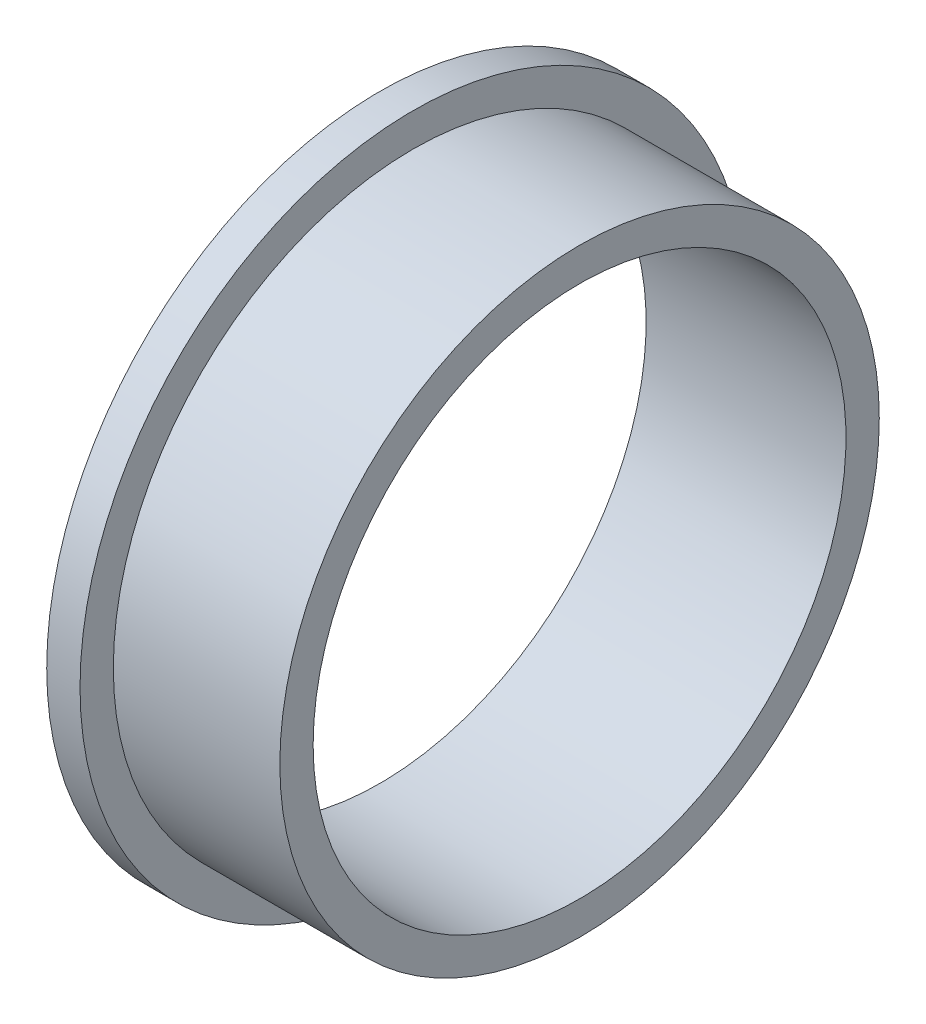
ISO-10303-21;
HEADER;
FILE_DESCRIPTION(('STEP AP214'),'2;1');
FILE_NAME('part.step','',(''),(''),'','','');
FILE_SCHEMA(('AUTOMOTIVE_DESIGN { 1 0 10303 214 1 1 1 1 }'));
ENDSEC;
DATA;
#1=APPLICATION_CONTEXT('core data for automotive mechanical design processes');
#2=APPLICATION_PROTOCOL_DEFINITION('international standard','automotive_design',2000,#1);
#3=PRODUCT_CONTEXT('',#1,'mechanical');
#4=PRODUCT('Part','Part','',(#3));
#5=PRODUCT_RELATED_PRODUCT_CATEGORY('part','',(#4));
#6=PRODUCT_DEFINITION_FORMATION('','',#4);
#7=PRODUCT_DEFINITION_CONTEXT('part definition',#1,'design');
#8=PRODUCT_DEFINITION('design','',#6,#7);
#9=PRODUCT_DEFINITION_SHAPE('','',#8);
#10=(LENGTH_UNIT() NAMED_UNIT(*) SI_UNIT(.MILLI.,.METRE.));
#11=(NAMED_UNIT(*) PLANE_ANGLE_UNIT() SI_UNIT($,.RADIAN.));
#12=(NAMED_UNIT(*) SI_UNIT($,.STERADIAN.) SOLID_ANGLE_UNIT());
#13=UNCERTAINTY_MEASURE_WITH_UNIT(LENGTH_MEASURE(1.E-05),#10,'distance_accuracy_value','');
#14=(GEOMETRIC_REPRESENTATION_CONTEXT(3) GLOBAL_UNCERTAINTY_ASSIGNED_CONTEXT((#13)) GLOBAL_UNIT_ASSIGNED_CONTEXT((#10,
#11,#12)) REPRESENTATION_CONTEXT('',''));
#15=CARTESIAN_POINT('',(0.,0.,0.));
#16=DIRECTION('',(0.,0.,1.));
#17=DIRECTION('',(1.,0.,0.));
#18=AXIS2_PLACEMENT_3D('',#15,#16,#17);
#19=CARTESIAN_POINT('',(-2.,0.,-20.));
#20=DIRECTION('',(1.,0.,0.));
#21=DIRECTION('',(0.,0.,-1.));
#22=AXIS2_PLACEMENT_3D('',#19,#20,#21);
#23=PLANE('',#22);
#24=CARTESIAN_POINT('',(-2.,0.,0.));
#25=DIRECTION('',(-1.,0.,0.));
#26=DIRECTION('',(0.,0.,1.));
#27=AXIS2_PLACEMENT_3D('',#24,#25,#26);
#28=CIRCLE('',#27,16.);
#29=CARTESIAN_POINT('',(-2.,0.,16.));
#30=VERTEX_POINT('',#29);
#31=EDGE_CURVE('E10',#30,#30,#28,.T.);
#32=ORIENTED_EDGE('',*,*,#31,.F.);
#33=EDGE_LOOP('',(#32));
#34=FACE_BOUND('',#33,.T.);
#35=CARTESIAN_POINT('',(-2.,0.,0.));
#36=DIRECTION('',(-1.,0.,0.));
#37=DIRECTION('',(0.,0.,1.));
#38=AXIS2_PLACEMENT_3D('',#35,#36,#37);
#39=CIRCLE('',#38,20.);
#40=CARTESIAN_POINT('',(-2.,0.,20.));
#41=VERTEX_POINT('',#40);
#42=EDGE_CURVE('E70',#41,#41,#39,.T.);
#43=ORIENTED_EDGE('',*,*,#42,.T.);
#44=EDGE_LOOP('',(#43));
#45=FACE_BOUND('',#44,.T.);
#46=ADVANCED_FACE('F43',(#34,#45),#23,.F.);
#47=CARTESIAN_POINT('',(0.,0.,0.));
#48=DIRECTION('',(-1.,0.,0.));
#49=DIRECTION('',(0.,0.,1.));
#50=AXIS2_PLACEMENT_3D('',#47,#48,#49);
#51=CYLINDRICAL_SURFACE('',#50,16.);
#52=CARTESIAN_POINT('',(10.,0.,0.));
#53=DIRECTION('',(-1.,0.,0.));
#54=DIRECTION('',(0.,0.,1.));
#55=AXIS2_PLACEMENT_3D('',#52,#53,#54);
#56=CIRCLE('',#55,16.);
#57=CARTESIAN_POINT('',(10.,0.,16.));
#58=VERTEX_POINT('',#57);
#59=EDGE_CURVE('E50',#58,#58,#56,.T.);
#60=ORIENTED_EDGE('',*,*,#59,.F.);
#61=EDGE_LOOP('',(#60));
#62=FACE_BOUND('',#61,.T.);
#63=ORIENTED_EDGE('',*,*,#31,.T.);
#64=EDGE_LOOP('',(#63));
#65=FACE_BOUND('',#64,.T.);
#66=ADVANCED_FACE('F96',(#62,#65),#51,.F.);
#67=CARTESIAN_POINT('',(10.,0.,-16.));
#68=DIRECTION('',(-1.,0.,0.));
#69=DIRECTION('',(0.,0.,1.));
#70=AXIS2_PLACEMENT_3D('',#67,#68,#69);
#71=PLANE('',#70);
#72=CARTESIAN_POINT('',(10.,0.,0.));
#73=DIRECTION('',(-1.,0.,0.));
#74=DIRECTION('',(0.,0.,1.));
#75=AXIS2_PLACEMENT_3D('',#72,#73,#74);
#76=CIRCLE('',#75,18.);
#77=CARTESIAN_POINT('',(10.,0.,18.));
#78=VERTEX_POINT('',#77);
#79=EDGE_CURVE('E55',#78,#78,#76,.T.);
#80=ORIENTED_EDGE('',*,*,#79,.F.);
#81=EDGE_LOOP('',(#80));
#82=FACE_BOUND('',#81,.T.);
#83=ORIENTED_EDGE('',*,*,#59,.T.);
#84=EDGE_LOOP('',(#83));
#85=FACE_BOUND('',#84,.T.);
#86=ADVANCED_FACE('F91',(#82,#85),#71,.F.);
#87=CARTESIAN_POINT('',(0.,0.,0.));
#88=DIRECTION('',(-1.,0.,0.));
#89=DIRECTION('',(0.,0.,1.));
#90=AXIS2_PLACEMENT_3D('',#87,#88,#89);
#91=CYLINDRICAL_SURFACE('',#90,18.);
#92=CARTESIAN_POINT('',(0.,0.,0.));
#93=DIRECTION('',(-1.,0.,0.));
#94=DIRECTION('',(0.,0.,1.));
#95=AXIS2_PLACEMENT_3D('',#92,#93,#94);
#96=CIRCLE('',#95,18.);
#97=CARTESIAN_POINT('',(0.,0.,18.));
#98=VERTEX_POINT('',#97);
#99=EDGE_CURVE('E60',#98,#98,#96,.T.);
#100=ORIENTED_EDGE('',*,*,#99,.F.);
#101=EDGE_LOOP('',(#100));
#102=FACE_BOUND('',#101,.T.);
#103=ORIENTED_EDGE('',*,*,#79,.T.);
#104=EDGE_LOOP('',(#103));
#105=FACE_BOUND('',#104,.T.);
#106=ADVANCED_FACE('F85',(#102,#105),#91,.T.);
#107=CARTESIAN_POINT('',(0.,0.,-18.));
#108=DIRECTION('',(-1.,0.,0.));
#109=DIRECTION('',(0.,0.,1.));
#110=AXIS2_PLACEMENT_3D('',#107,#108,#109);
#111=PLANE('',#110);
#112=CARTESIAN_POINT('',(0.,0.,0.));
#113=DIRECTION('',(-1.,0.,0.));
#114=DIRECTION('',(0.,0.,1.));
#115=AXIS2_PLACEMENT_3D('',#112,#113,#114);
#116=CIRCLE('',#115,20.);
#117=CARTESIAN_POINT('',(0.,0.,20.));
#118=VERTEX_POINT('',#117);
#119=EDGE_CURVE('E66',#118,#118,#116,.T.);
#120=ORIENTED_EDGE('',*,*,#119,.F.);
#121=EDGE_LOOP('',(#120));
#122=FACE_BOUND('',#121,.T.);
#123=ORIENTED_EDGE('',*,*,#99,.T.);
#124=EDGE_LOOP('',(#123));
#125=FACE_BOUND('',#124,.T.);
#126=ADVANCED_FACE('F79',(#122,#125),#111,.F.);
#127=CARTESIAN_POINT('',(0.,0.,0.));
#128=DIRECTION('',(-1.,0.,0.));
#129=DIRECTION('',(0.,0.,1.));
#130=AXIS2_PLACEMENT_3D('',#127,#128,#129);
#131=CYLINDRICAL_SURFACE('',#130,20.);
#132=ORIENTED_EDGE('',*,*,#42,.F.);
#133=EDGE_LOOP('',(#132));
#134=FACE_BOUND('',#133,.T.);
#135=ORIENTED_EDGE('',*,*,#119,.T.);
#136=EDGE_LOOP('',(#135));
#137=FACE_BOUND('',#136,.T.);
#138=ADVANCED_FACE('F76',(#134,#137),#131,.T.);
#139=CLOSED_SHELL('',(#46,#66,#86,#106,#126,#138));
#140=MANIFOLD_SOLID_BREP('B2',#139);
#141=ADVANCED_BREP_SHAPE_REPRESENTATION('',(#18,#140),#14);
#142=SHAPE_DEFINITION_REPRESENTATION(#9,#141);
ENDSEC;
END-ISO-10303-21;
